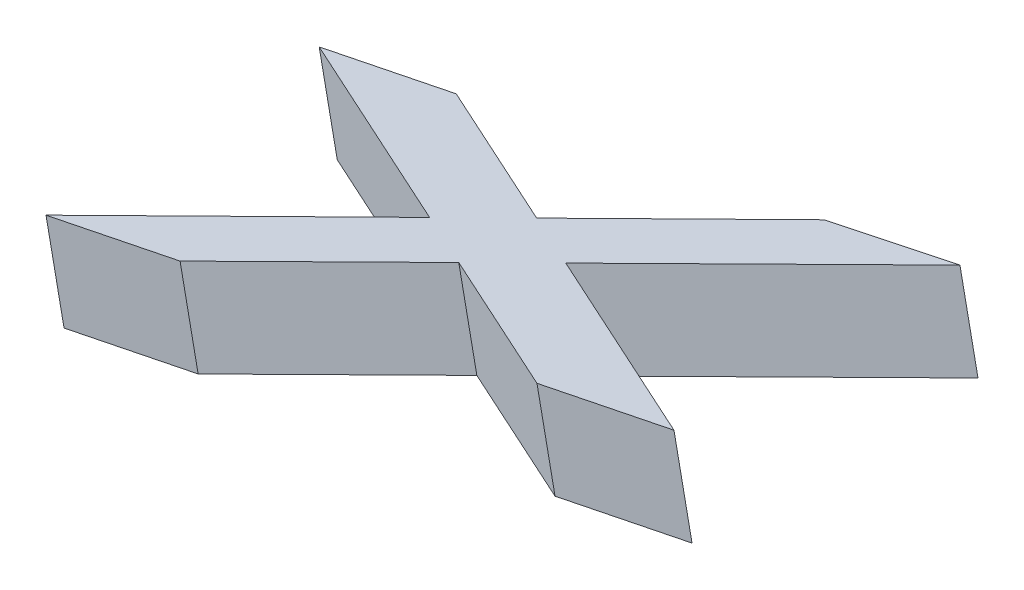
ISO-10303-21;
HEADER;
FILE_DESCRIPTION(('STEP AP214'),'2;1');
FILE_NAME('part.step','',(''),(''),'','','');
FILE_SCHEMA(('AUTOMOTIVE_DESIGN { 1 0 10303 214 1 1 1 1 }'));
ENDSEC;
DATA;
#1=APPLICATION_CONTEXT('core data for automotive mechanical design processes');
#2=APPLICATION_PROTOCOL_DEFINITION('international standard','automotive_design',2000,#1);
#3=PRODUCT_CONTEXT('',#1,'mechanical');
#4=PRODUCT('Part','Part','',(#3));
#5=PRODUCT_RELATED_PRODUCT_CATEGORY('part','',(#4));
#6=PRODUCT_DEFINITION_FORMATION('','',#4);
#7=PRODUCT_DEFINITION_CONTEXT('part definition',#1,'design');
#8=PRODUCT_DEFINITION('design','',#6,#7);
#9=PRODUCT_DEFINITION_SHAPE('','',#8);
#10=(LENGTH_UNIT() NAMED_UNIT(*) SI_UNIT(.MILLI.,.METRE.));
#11=(NAMED_UNIT(*) PLANE_ANGLE_UNIT() SI_UNIT($,.RADIAN.));
#12=(NAMED_UNIT(*) SI_UNIT($,.STERADIAN.) SOLID_ANGLE_UNIT());
#13=UNCERTAINTY_MEASURE_WITH_UNIT(LENGTH_MEASURE(1.E-05),#10,'distance_accuracy_value','');
#14=(GEOMETRIC_REPRESENTATION_CONTEXT(3) GLOBAL_UNCERTAINTY_ASSIGNED_CONTEXT((#13)) GLOBAL_UNIT_ASSIGNED_CONTEXT((#10,
#11,#12)) REPRESENTATION_CONTEXT('',''));
#15=CARTESIAN_POINT('',(0.,0.,0.));
#16=DIRECTION('',(0.,0.,1.));
#17=DIRECTION('',(1.,0.,0.));
#18=AXIS2_PLACEMENT_3D('',#15,#16,#17);
#19=CARTESIAN_POINT('',(-31.8198121357776,15.9615591593475,38.7490590934387));
#20=DIRECTION('',(-0.00942272855190236,-0.00191696570691125,-0.999953767645843));
#21=DIRECTION('',(-0.999955604944721,0.,0.00942274586507139));
#22=AXIS2_PLACEMENT_3D('',#19,#20,#21);
#23=PLANE('',#22);
#24=DIRECTION('',(0.9798816368308,0.199347724418685,-0.00961574598688576));
#25=VECTOR('',#24,1.);
#26=CARTESIAN_POINT('',(-30.0475289288706,7.25000865243336,38.7490590934387));
#27=LINE('',#26,#25);
#28=CARTESIAN_POINT('',(-30.0475289288706,7.25000865243336,38.7490590934387));
#29=VERTEX_POINT('',#28);
#30=CARTESIAN_POINT('',(-16.8386250303581,9.93723620651827,38.6194378617723));
#31=VERTEX_POINT('',#30);
#32=EDGE_CURVE('E156',#29,#31,#27,.T.);
#33=ORIENTED_EDGE('',*,*,#32,.F.);
#34=DIRECTION('',(0.199356941159392,-0.979926941160192,0.));
#35=VECTOR('',#34,1.);
#36=CARTESIAN_POINT('',(-31.8198121357776,15.9615591593475,38.7490590934387));
#37=LINE('',#36,#35);
#38=CARTESIAN_POINT('',(-31.8198121357776,15.9615591593475,38.7490590934387));
#39=VERTEX_POINT('',#38);
#40=EDGE_CURVE('E11',#39,#29,#37,.T.);
#41=ORIENTED_EDGE('',*,*,#40,.F.);
#42=DIRECTION('',(0.9798816368308,0.199347724418685,-0.00961574598688576));
#43=VECTOR('',#42,1.);
#44=CARTESIAN_POINT('',(-31.8198121357776,15.9615591593475,38.7490590934387));
#45=LINE('',#44,#43);
#46=CARTESIAN_POINT('',(-18.6109082372651,18.6487867134324,38.6194378617723));
#47=VERTEX_POINT('',#46);
#48=EDGE_CURVE('E188',#39,#47,#45,.T.);
#49=ORIENTED_EDGE('',*,*,#48,.T.);
#50=DIRECTION('',(0.199356941159392,-0.979926941160192,0.));
#51=VECTOR('',#50,1.);
#52=CARTESIAN_POINT('',(-18.6109082372651,18.6487867134324,38.6194378617723));
#53=LINE('',#52,#51);
#54=EDGE_CURVE('E38',#47,#31,#53,.T.);
#55=ORIENTED_EDGE('',*,*,#54,.T.);
#56=EDGE_LOOP('',(#33,#41,#49,#55));
#57=FACE_BOUND('',#56,.T.);
#58=ADVANCED_FACE('F35',(#57),#23,.T.);
#59=CARTESIAN_POINT('',(-49.7096169912392,12.3220462282092,49.0693940770227));
#60=DIRECTION('',(-0.482236012298826,-0.0981063917019924,-0.870530622292715));
#61=DIRECTION('',(-0.874750477960503,0.,0.484573628366083));
#62=AXIS2_PLACEMENT_3D('',#59,#60,#61);
#63=PLANE('',#62);
#64=DIRECTION('',(0.853056409889579,0.173546322045858,-0.492114250607172));
#65=VECTOR('',#64,1.);
#66=CARTESIAN_POINT('',(-47.9373337843322,3.61049572129509,49.0693940770227));
#67=LINE('',#66,#65);
#68=CARTESIAN_POINT('',(-47.9373337843322,3.61049572129509,49.0693940770227));
#69=VERTEX_POINT('',#68);
#70=EDGE_CURVE('E186',#69,#29,#67,.T.);
#71=ORIENTED_EDGE('',*,*,#70,.F.);
#72=DIRECTION('',(0.199356941159392,-0.979926941160192,0.));
#73=VECTOR('',#72,1.);
#74=CARTESIAN_POINT('',(-49.7096169912392,12.3220462282092,49.0693940770227));
#75=LINE('',#74,#73);
#76=CARTESIAN_POINT('',(-49.7096169912392,12.3220462282092,49.0693940770227));
#77=VERTEX_POINT('',#76);
#78=EDGE_CURVE('E44',#77,#69,#75,.T.);
#79=ORIENTED_EDGE('',*,*,#78,.F.);
#80=DIRECTION('',(0.853056409889579,0.173546322045858,-0.492114250607172));
#81=VECTOR('',#80,1.);
#82=CARTESIAN_POINT('',(-49.7096169912392,12.3220462282092,49.0693940770227));
#83=LINE('',#82,#81);
#84=EDGE_CURVE('E146',#77,#39,#83,.T.);
#85=ORIENTED_EDGE('',*,*,#84,.T.);
#86=ORIENTED_EDGE('',*,*,#40,.T.);
#87=EDGE_LOOP('',(#71,#79,#85,#86));
#88=FACE_BOUND('',#87,.T.);
#89=ADVANCED_FACE('F208',(#88),#63,.T.);
#90=CARTESIAN_POINT('',(-67.9250082372651,8.61629580100908,38.7490590934387));
#91=DIRECTION('',(0.475661407088986,0.096768849964021,-0.874289434616916));
#92=DIRECTION('',(-0.878411925293683,0.,-0.477904268135204));
#93=AXIS2_PLACEMENT_3D('',#90,#91,#92);
#94=PLANE('',#93);
#95=DIRECTION('',(0.856739771352828,0.174295667373203,0.485404969605002));
#96=VECTOR('',#95,1.);
#97=CARTESIAN_POINT('',(-66.1527250303581,-0.0952547059050284,38.7490590934387));
#98=LINE('',#97,#96);
#99=CARTESIAN_POINT('',(-66.1527250303581,-0.0952547059050284,38.7490590934387));
#100=VERTEX_POINT('',#99);
#101=EDGE_CURVE('E133',#100,#69,#98,.T.);
#102=ORIENTED_EDGE('',*,*,#101,.F.);
#103=DIRECTION('',(0.199356941159392,-0.979926941160192,0.));
#104=VECTOR('',#103,1.);
#105=CARTESIAN_POINT('',(-67.9250082372651,8.61629580100908,38.7490590934387));
#106=LINE('',#105,#104);
#107=CARTESIAN_POINT('',(-67.9250082372651,8.61629580100908,38.7490590934387));
#108=VERTEX_POINT('',#107);
#109=EDGE_CURVE('E128',#108,#100,#106,.T.);
#110=ORIENTED_EDGE('',*,*,#109,.F.);
#111=DIRECTION('',(0.856739771352828,0.174295667373203,0.485404969605002));
#112=VECTOR('',#111,1.);
#113=CARTESIAN_POINT('',(-67.9250082372651,8.61629580100908,38.7490590934387));
#114=LINE('',#113,#112);
#115=EDGE_CURVE('E131',#108,#77,#114,.T.);
#116=ORIENTED_EDGE('',*,*,#115,.T.);
#117=ORIENTED_EDGE('',*,*,#78,.T.);
#118=EDGE_LOOP('',(#102,#110,#116,#117));
#119=FACE_BOUND('',#118,.T.);
#120=ADVANCED_FACE('F130',(#119),#94,.T.);
#121=CARTESIAN_POINT('',(-81.3743082372651,5.88016191580273,38.7490590934387));
#122=DIRECTION('',(0.,0.,-1.));
#123=DIRECTION('',(-1.,0.,0.));
#124=AXIS2_PLACEMENT_3D('',#121,#122,#123);
#125=PLANE('',#124);
#126=DIRECTION('',(0.979926941160192,0.199356941159392,0.));
#127=VECTOR('',#126,1.);
#128=CARTESIAN_POINT('',(-79.6020250303581,-2.83138859111138,38.7490590934387));
#129=LINE('',#128,#127);
#130=CARTESIAN_POINT('',(-79.6020250303581,-2.83138859111138,38.7490590934387));
#131=VERTEX_POINT('',#130);
#132=EDGE_CURVE('E183',#131,#100,#129,.T.);
#133=ORIENTED_EDGE('',*,*,#132,.F.);
#134=DIRECTION('',(0.199356941159392,-0.979926941160192,0.));
#135=VECTOR('',#134,1.);
#136=CARTESIAN_POINT('',(-81.3743082372651,5.88016191580273,38.7490590934387));
#137=LINE('',#136,#135);
#138=CARTESIAN_POINT('',(-81.3743082372651,5.88016191580273,38.7490590934387));
#139=VERTEX_POINT('',#138);
#140=EDGE_CURVE('E138',#139,#131,#137,.T.);
#141=ORIENTED_EDGE('',*,*,#140,.F.);
#142=DIRECTION('',(0.979926941160192,0.199356941159392,0.));
#143=VECTOR('',#142,1.);
#144=CARTESIAN_POINT('',(-81.3743082372651,5.88016191580273,38.7490590934387));
#145=LINE('',#144,#143);
#146=EDGE_CURVE('E144',#139,#108,#145,.T.);
#147=ORIENTED_EDGE('',*,*,#146,.T.);
#148=ORIENTED_EDGE('',*,*,#109,.T.);
#149=EDGE_LOOP('',(#133,#141,#147,#148));
#150=FACE_BOUND('',#149,.T.);
#151=ADVANCED_FACE('F148',(#150),#125,.T.);
#152=CARTESIAN_POINT('',(-56.373626009948,10.9663161242328,52.913751573505));
#153=DIRECTION('',(-0.475661407088986,-0.0967688499640211,0.874289434616916));
#154=DIRECTION('',(0.878411925293683,0.,0.477904268135204));
#155=AXIS2_PLACEMENT_3D('',#152,#153,#154);
#156=PLANE('',#155);
#157=DIRECTION('',(-0.856739771352828,-0.174295667373203,-0.485404969605003));
#158=VECTOR('',#157,1.);
#159=CARTESIAN_POINT('',(-54.601342803041,2.2547656173187,52.913751573505));
#160=LINE('',#159,#158);
#161=CARTESIAN_POINT('',(-54.601342803041,2.2547656173187,52.913751573505));
#162=VERTEX_POINT('',#161);
#163=EDGE_CURVE('E180',#162,#131,#160,.T.);
#164=ORIENTED_EDGE('',*,*,#163,.F.);
#165=DIRECTION('',(0.199356941159392,-0.979926941160192,0.));
#166=VECTOR('',#165,1.);
#167=CARTESIAN_POINT('',(-56.373626009948,10.9663161242328,52.913751573505));
#168=LINE('',#167,#166);
#169=CARTESIAN_POINT('',(-56.373626009948,10.9663161242328,52.913751573505));
#170=VERTEX_POINT('',#169);
#171=EDGE_CURVE('E192',#170,#162,#168,.T.);
#172=ORIENTED_EDGE('',*,*,#171,.F.);
#173=DIRECTION('',(-0.856739771352828,-0.174295667373203,-0.485404969605003));
#174=VECTOR('',#173,1.);
#175=CARTESIAN_POINT('',(-56.373626009948,10.9663161242328,52.913751573505));
#176=LINE('',#175,#174);
#177=EDGE_CURVE('E149',#170,#139,#176,.T.);
#178=ORIENTED_EDGE('',*,*,#177,.T.);
#179=ORIENTED_EDGE('',*,*,#140,.T.);
#180=EDGE_LOOP('',(#164,#172,#178,#179));
#181=FACE_BOUND('',#180,.T.);
#182=ADVANCED_FACE('F221',(#181),#156,.T.);
#183=CARTESIAN_POINT('',(-80.2524597636564,6.10839146103614,66.6890590934387));
#184=DIRECTION('',(-0.482236012298827,-0.0981063917019925,-0.870530622292715));
#185=DIRECTION('',(-0.874750477960503,0.,0.484573628366084));
#186=AXIS2_PLACEMENT_3D('',#183,#184,#185);
#187=PLANE('',#186);
#188=DIRECTION('',(0.853056409889578,0.173546322045858,-0.492114250607172));
#189=VECTOR('',#188,1.);
#190=CARTESIAN_POINT('',(-78.4801765567494,-2.60315904587797,66.6890590934387));
#191=LINE('',#190,#189);
#192=CARTESIAN_POINT('',(-78.4801765567494,-2.60315904587797,66.6890590934387));
#193=VERTEX_POINT('',#192);
#194=EDGE_CURVE('E177',#193,#162,#191,.T.);
#195=ORIENTED_EDGE('',*,*,#194,.F.);
#196=DIRECTION('',(0.199356941159392,-0.979926941160192,0.));
#197=VECTOR('',#196,1.);
#198=CARTESIAN_POINT('',(-80.2524597636564,6.10839146103614,66.6890590934387));
#199=LINE('',#198,#197);
#200=CARTESIAN_POINT('',(-80.2524597636564,6.10839146103614,66.6890590934387));
#201=VERTEX_POINT('',#200);
#202=EDGE_CURVE('E194',#201,#193,#199,.T.);
#203=ORIENTED_EDGE('',*,*,#202,.F.);
#204=DIRECTION('',(0.853056409889578,0.173546322045858,-0.492114250607172));
#205=VECTOR('',#204,1.);
#206=CARTESIAN_POINT('',(-80.2524597636564,6.10839146103614,66.6890590934387));
#207=LINE('',#206,#205);
#208=EDGE_CURVE('E151',#201,#170,#207,.T.);
#209=ORIENTED_EDGE('',*,*,#208,.T.);
#210=ORIENTED_EDGE('',*,*,#171,.T.);
#211=EDGE_LOOP('',(#195,#203,#209,#210));
#212=FACE_BOUND('',#211,.T.);
#213=ADVANCED_FACE('F224',(#212),#187,.T.);
#214=CARTESIAN_POINT('',(-67.0915293188597,8.78585926611538,66.6890590934387));
#215=DIRECTION('',(0.,0.,1.));
#216=DIRECTION('',(1.,0.,0.));
#217=AXIS2_PLACEMENT_3D('',#214,#215,#216);
#218=PLANE('',#217);
#219=DIRECTION('',(-0.979926941160192,-0.199356941159392,0.));
#220=VECTOR('',#219,1.);
#221=CARTESIAN_POINT('',(-65.3192461119527,0.0743087592012717,66.6890590934387));
#222=LINE('',#221,#220);
#223=CARTESIAN_POINT('',(-65.3192461119527,0.0743087592012717,66.6890590934387));
#224=VERTEX_POINT('',#223);
#225=EDGE_CURVE('E174',#224,#193,#222,.T.);
#226=ORIENTED_EDGE('',*,*,#225,.F.);
#227=DIRECTION('',(0.199356941159392,-0.979926941160192,0.));
#228=VECTOR('',#227,1.);
#229=CARTESIAN_POINT('',(-67.0915293188597,8.78585926611538,66.6890590934387));
#230=LINE('',#229,#228);
#231=CARTESIAN_POINT('',(-67.0915293188597,8.78585926611538,66.6890590934387));
#232=VERTEX_POINT('',#231);
#233=EDGE_CURVE('E196',#232,#224,#230,.T.);
#234=ORIENTED_EDGE('',*,*,#233,.F.);
#235=DIRECTION('',(-0.979926941160192,-0.199356941159392,0.));
#236=VECTOR('',#235,1.);
#237=CARTESIAN_POINT('',(-67.0915293188597,8.78585926611538,66.6890590934387));
#238=LINE('',#237,#236);
#239=EDGE_CURVE('E350',#232,#201,#238,.T.);
#240=ORIENTED_EDGE('',*,*,#239,.T.);
#241=ORIENTED_EDGE('',*,*,#202,.T.);
#242=EDGE_LOOP('',(#226,#234,#240,#241));
#243=FACE_BOUND('',#242,.T.);
#244=ADVANCED_FACE('F228',(#243),#218,.T.);
#245=CARTESIAN_POINT('',(-49.7656823630939,12.3106402543876,56.6576289938189));
#246=DIRECTION('',(0.48356636511201,0.0983770394986384,0.869761765446057));
#247=DIRECTION('',(0.874001359013465,0.,-0.485923475912222));
#248=AXIS2_PLACEMENT_3D('',#245,#246,#247);
#249=PLANE('',#248);
#250=DIRECTION('',(-0.852302986351643,-0.173393045096719,0.49347185468693));
#251=VECTOR('',#250,1.);
#252=CARTESIAN_POINT('',(-47.9933991561869,3.59908974747353,56.6576289938189));
#253=LINE('',#252,#251);
#254=CARTESIAN_POINT('',(-47.9933991561869,3.59908974747353,56.6576289938189));
#255=VERTEX_POINT('',#254);
#256=EDGE_CURVE('E171',#255,#224,#253,.T.);
#257=ORIENTED_EDGE('',*,*,#256,.F.);
#258=DIRECTION('',(0.199356941159392,-0.979926941160192,0.));
#259=VECTOR('',#258,1.);
#260=CARTESIAN_POINT('',(-49.7656823630939,12.3106402543876,56.6576289938189));
#261=LINE('',#260,#259);
#262=CARTESIAN_POINT('',(-49.7656823630939,12.3106402543876,56.6576289938189));
#263=VERTEX_POINT('',#262);
#264=EDGE_CURVE('E198',#263,#255,#261,.T.);
#265=ORIENTED_EDGE('',*,*,#264,.F.);
#266=DIRECTION('',(-0.852302986351643,-0.173393045096719,0.49347185468693));
#267=VECTOR('',#266,1.);
#268=CARTESIAN_POINT('',(-49.7656823630939,12.3106402543876,56.6576289938189));
#269=LINE('',#268,#267);
#270=EDGE_CURVE('E354',#263,#232,#269,.T.);
#271=ORIENTED_EDGE('',*,*,#270,.T.);
#272=ORIENTED_EDGE('',*,*,#233,.T.);
#273=EDGE_LOOP('',(#257,#265,#271,#272));
#274=FACE_BOUND('',#273,.T.);
#275=ADVANCED_FACE('F232',(#274),#249,.T.);
#276=CARTESIAN_POINT('',(-32.0602082372651,15.912652828226,66.6890590934387));
#277=DIRECTION('',(-0.475661407088985,-0.0967688499640209,0.874289434616916));
#278=DIRECTION('',(0.878411925293683,0.,0.477904268135203));
#279=AXIS2_PLACEMENT_3D('',#276,#277,#278);
#280=PLANE('',#279);
#281=DIRECTION('',(-0.856739771352829,-0.174295667373203,-0.485404969605002));
#282=VECTOR('',#281,1.);
#283=CARTESIAN_POINT('',(-30.2879250303581,7.20110232131191,66.6890590934387));
#284=LINE('',#283,#282);
#285=CARTESIAN_POINT('',(-30.2879250303581,7.20110232131191,66.6890590934387));
#286=VERTEX_POINT('',#285);
#287=EDGE_CURVE('E168',#286,#255,#284,.T.);
#288=ORIENTED_EDGE('',*,*,#287,.F.);
#289=DIRECTION('',(0.199356941159392,-0.979926941160192,0.));
#290=VECTOR('',#289,1.);
#291=CARTESIAN_POINT('',(-32.0602082372651,15.912652828226,66.6890590934387));
#292=LINE('',#291,#290);
#293=CARTESIAN_POINT('',(-32.0602082372651,15.912652828226,66.6890590934387));
#294=VERTEX_POINT('',#293);
#295=EDGE_CURVE('E200',#294,#286,#292,.T.);
#296=ORIENTED_EDGE('',*,*,#295,.F.);
#297=DIRECTION('',(-0.856739771352829,-0.174295667373203,-0.485404969605002));
#298=VECTOR('',#297,1.);
#299=CARTESIAN_POINT('',(-32.0602082372651,15.912652828226,66.6890590934387));
#300=LINE('',#299,#298);
#301=EDGE_CURVE('E343',#294,#263,#300,.T.);
#302=ORIENTED_EDGE('',*,*,#301,.T.);
#303=ORIENTED_EDGE('',*,*,#264,.T.);
#304=EDGE_LOOP('',(#288,#296,#302,#303));
#305=FACE_BOUND('',#304,.T.);
#306=ADVANCED_FACE('F236',(#305),#280,.T.);
#307=CARTESIAN_POINT('',(-18.6109082372651,18.6487867134324,66.6890590934387));
#308=DIRECTION('',(0.,0.,1.));
#309=DIRECTION('',(1.,0.,0.));
#310=AXIS2_PLACEMENT_3D('',#307,#308,#309);
#311=PLANE('',#310);
#312=DIRECTION('',(-0.979926941160192,-0.199356941159392,0.));
#313=VECTOR('',#312,1.);
#314=CARTESIAN_POINT('',(-16.8386250303581,9.93723620651827,66.6890590934387));
#315=LINE('',#314,#313);
#316=CARTESIAN_POINT('',(-16.8386250303581,9.93723620651827,66.6890590934387));
#317=VERTEX_POINT('',#316);
#318=EDGE_CURVE('E165',#317,#286,#315,.T.);
#319=ORIENTED_EDGE('',*,*,#318,.F.);
#320=DIRECTION('',(0.199356941159392,-0.979926941160192,0.));
#321=VECTOR('',#320,1.);
#322=CARTESIAN_POINT('',(-18.6109082372651,18.6487867134324,66.6890590934387));
#323=LINE('',#322,#321);
#324=CARTESIAN_POINT('',(-18.6109082372651,18.6487867134324,66.6890590934387));
#325=VERTEX_POINT('',#324);
#326=EDGE_CURVE('E202',#325,#317,#323,.T.);
#327=ORIENTED_EDGE('',*,*,#326,.F.);
#328=DIRECTION('',(-0.979926941160192,-0.199356941159392,0.));
#329=VECTOR('',#328,1.);
#330=CARTESIAN_POINT('',(-18.6109082372651,18.6487867134324,66.6890590934387));
#331=LINE('',#330,#329);
#332=EDGE_CURVE('E339',#325,#294,#331,.T.);
#333=ORIENTED_EDGE('',*,*,#332,.T.);
#334=ORIENTED_EDGE('',*,*,#295,.T.);
#335=EDGE_LOOP('',(#319,#327,#333,#334));
#336=FACE_BOUND('',#335,.T.);
#337=ADVANCED_FACE('F240',(#336),#311,.T.);
#338=CARTESIAN_POINT('',(-43.1139060021787,13.6638817389195,52.8063408130343));
#339=DIRECTION('',(0.475661407088986,0.096768849964021,-0.874289434616916));
#340=DIRECTION('',(-0.878411925293683,0.,-0.477904268135204));
#341=AXIS2_PLACEMENT_3D('',#338,#339,#340);
#342=PLANE('',#341);
#343=DIRECTION('',(0.856739771352828,0.174295667373203,0.485404969605002));
#344=VECTOR('',#343,1.);
#345=CARTESIAN_POINT('',(-41.3416227952717,4.95233123200542,52.8063408130343));
#346=LINE('',#345,#344);
#347=CARTESIAN_POINT('',(-41.3416227952717,4.95233123200542,52.8063408130343));
#348=VERTEX_POINT('',#347);
#349=EDGE_CURVE('E162',#348,#317,#346,.T.);
#350=ORIENTED_EDGE('',*,*,#349,.F.);
#351=DIRECTION('',(0.199356941159392,-0.979926941160192,0.));
#352=VECTOR('',#351,1.);
#353=CARTESIAN_POINT('',(-43.1139060021787,13.6638817389195,52.8063408130343));
#354=LINE('',#353,#352);
#355=CARTESIAN_POINT('',(-43.1139060021787,13.6638817389195,52.8063408130343));
#356=VERTEX_POINT('',#355);
#357=EDGE_CURVE('E203',#356,#348,#354,.T.);
#358=ORIENTED_EDGE('',*,*,#357,.F.);
#359=DIRECTION('',(0.856739771352828,0.174295667373203,0.485404969605002));
#360=VECTOR('',#359,1.);
#361=CARTESIAN_POINT('',(-43.1139060021787,13.6638817389195,52.8063408130343));
#362=LINE('',#361,#360);
#363=EDGE_CURVE('E360',#356,#325,#362,.T.);
#364=ORIENTED_EDGE('',*,*,#363,.T.);
#365=ORIENTED_EDGE('',*,*,#326,.T.);
#366=EDGE_LOOP('',(#350,#358,#364,#365));
#367=FACE_BOUND('',#366,.T.);
#368=ADVANCED_FACE('F244',(#367),#342,.T.);
#369=CARTESIAN_POINT('',(-18.6109082372651,18.6487867134324,38.6194378617723));
#370=DIRECTION('',(0.48356636511201,0.0983770394986385,0.869761765446057));
#371=DIRECTION('',(0.874001359013466,0.,-0.485923475912222));
#372=AXIS2_PLACEMENT_3D('',#369,#370,#371);
#373=PLANE('',#372);
#374=DIRECTION('',(-0.852302986351643,-0.173393045096719,0.49347185468693));
#375=VECTOR('',#374,1.);
#376=CARTESIAN_POINT('',(-16.8386250303581,9.93723620651827,38.6194378617723));
#377=LINE('',#376,#375);
#378=EDGE_CURVE('E159',#31,#348,#377,.T.);
#379=ORIENTED_EDGE('',*,*,#378,.F.);
#380=ORIENTED_EDGE('',*,*,#54,.F.);
#381=DIRECTION('',(-0.852302986351643,-0.173393045096719,0.49347185468693));
#382=VECTOR('',#381,1.);
#383=CARTESIAN_POINT('',(-18.6109082372651,18.6487867134324,38.6194378617723));
#384=LINE('',#383,#382);
#385=EDGE_CURVE('E362',#47,#356,#384,.T.);
#386=ORIENTED_EDGE('',*,*,#385,.T.);
#387=ORIENTED_EDGE('',*,*,#357,.T.);
#388=EDGE_LOOP('',(#379,#380,#386,#387));
#389=FACE_BOUND('',#388,.T.);
#390=ADVANCED_FACE('F205',(#389),#373,.T.);
#391=CARTESIAN_POINT('',(-4.38279502034108,21.5433628397273,0.));
#392=DIRECTION('',(0.199356941159392,-0.979926941160192,0.));
#393=DIRECTION('',(0.979926941160192,0.199356941159392,0.));
#394=AXIS2_PLACEMENT_3D('',#391,#392,#393);
#395=PLANE('',#394);
#396=ORIENTED_EDGE('',*,*,#48,.F.);
#397=ORIENTED_EDGE('',*,*,#84,.F.);
#398=ORIENTED_EDGE('',*,*,#115,.F.);
#399=ORIENTED_EDGE('',*,*,#146,.F.);
#400=ORIENTED_EDGE('',*,*,#177,.F.);
#401=ORIENTED_EDGE('',*,*,#208,.F.);
#402=ORIENTED_EDGE('',*,*,#239,.F.);
#403=ORIENTED_EDGE('',*,*,#270,.F.);
#404=ORIENTED_EDGE('',*,*,#301,.F.);
#405=ORIENTED_EDGE('',*,*,#332,.F.);
#406=ORIENTED_EDGE('',*,*,#363,.F.);
#407=ORIENTED_EDGE('',*,*,#385,.F.);
#408=EDGE_LOOP('',(#396,#397,#398,#399,#400,#401,#402,#403,#404,#405,#406,#407));
#409=FACE_BOUND('',#408,.T.);
#410=ADVANCED_FACE('F142',(#409),#395,.F.);
#411=CARTESIAN_POINT('',(-2.61051181343408,12.8318123328132,0.));
#412=DIRECTION('',(0.199356941159392,-0.979926941160192,0.));
#413=DIRECTION('',(0.979926941160192,0.199356941159392,0.));
#414=AXIS2_PLACEMENT_3D('',#411,#412,#413);
#415=PLANE('',#414);
#416=ORIENTED_EDGE('',*,*,#32,.T.);
#417=ORIENTED_EDGE('',*,*,#378,.T.);
#418=ORIENTED_EDGE('',*,*,#349,.T.);
#419=ORIENTED_EDGE('',*,*,#318,.T.);
#420=ORIENTED_EDGE('',*,*,#287,.T.);
#421=ORIENTED_EDGE('',*,*,#256,.T.);
#422=ORIENTED_EDGE('',*,*,#225,.T.);
#423=ORIENTED_EDGE('',*,*,#194,.T.);
#424=ORIENTED_EDGE('',*,*,#163,.T.);
#425=ORIENTED_EDGE('',*,*,#132,.T.);
#426=ORIENTED_EDGE('',*,*,#101,.T.);
#427=ORIENTED_EDGE('',*,*,#70,.T.);
#428=EDGE_LOOP('',(#416,#417,#418,#419,#420,#421,#422,#423,#424,#425,#426,#427));
#429=FACE_BOUND('',#428,.T.);
#430=ADVANCED_FACE('F207',(#429),#415,.T.);
#431=CLOSED_SHELL('',(#58,#89,#120,#151,#182,#213,#244,#275,#306,#337,#368,#390,#410,#430));
#432=MANIFOLD_SOLID_BREP('B2',#431);
#433=ADVANCED_BREP_SHAPE_REPRESENTATION('',(#18,#432),#14);
#434=SHAPE_DEFINITION_REPRESENTATION(#9,#433);
ENDSEC;
END-ISO-10303-21;
